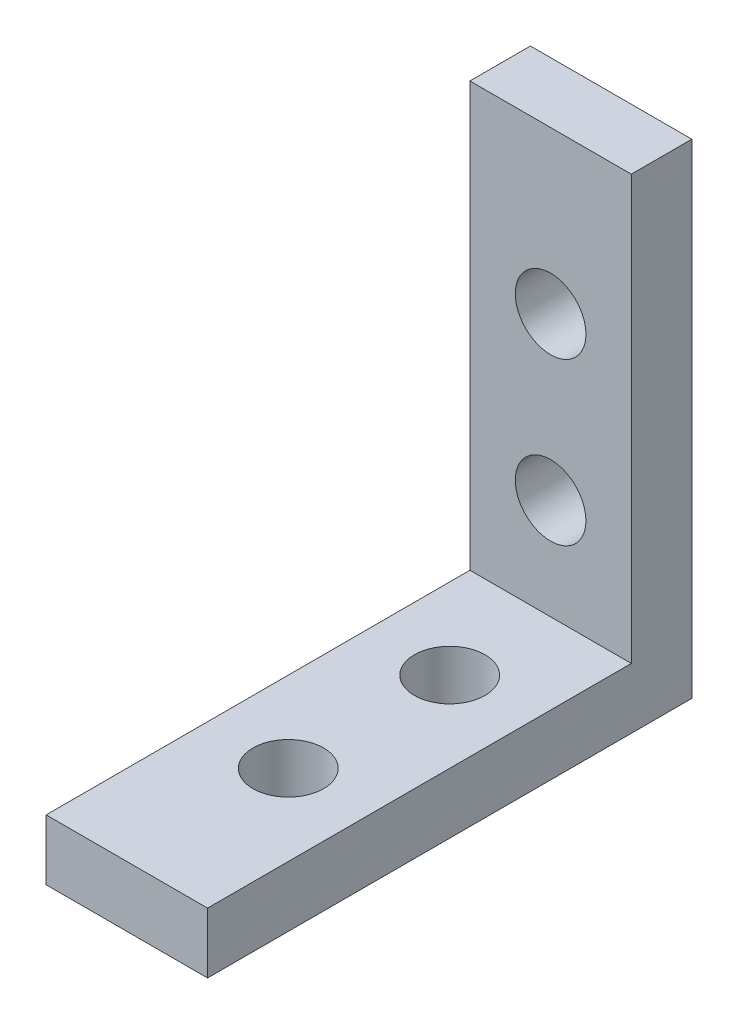
ISO-10303-21;
HEADER;
FILE_DESCRIPTION(('STEP AP214'),'2;1');
FILE_NAME('part.step','',(''),(''),'','','');
FILE_SCHEMA(('AUTOMOTIVE_DESIGN { 1 0 10303 214 1 1 1 1 }'));
ENDSEC;
DATA;
#1=APPLICATION_CONTEXT('core data for automotive mechanical design processes');
#2=APPLICATION_PROTOCOL_DEFINITION('international standard','automotive_design',2000,#1);
#3=PRODUCT_CONTEXT('',#1,'mechanical');
#4=PRODUCT('Part','Part','',(#3));
#5=PRODUCT_RELATED_PRODUCT_CATEGORY('part','',(#4));
#6=PRODUCT_DEFINITION_FORMATION('','',#4);
#7=PRODUCT_DEFINITION_CONTEXT('part definition',#1,'design');
#8=PRODUCT_DEFINITION('design','',#6,#7);
#9=PRODUCT_DEFINITION_SHAPE('','',#8);
#10=(LENGTH_UNIT() NAMED_UNIT(*) SI_UNIT(.MILLI.,.METRE.));
#11=(NAMED_UNIT(*) PLANE_ANGLE_UNIT() SI_UNIT($,.RADIAN.));
#12=(NAMED_UNIT(*) SI_UNIT($,.STERADIAN.) SOLID_ANGLE_UNIT());
#13=UNCERTAINTY_MEASURE_WITH_UNIT(LENGTH_MEASURE(1.E-05),#10,'distance_accuracy_value','');
#14=(GEOMETRIC_REPRESENTATION_CONTEXT(3) GLOBAL_UNCERTAINTY_ASSIGNED_CONTEXT((#13)) GLOBAL_UNIT_ASSIGNED_CONTEXT((#10,
#11,#12)) REPRESENTATION_CONTEXT('',''));
#15=CARTESIAN_POINT('',(0.,0.,0.));
#16=DIRECTION('',(0.,0.,1.));
#17=DIRECTION('',(1.,0.,0.));
#18=AXIS2_PLACEMENT_3D('',#15,#16,#17);
#19=CARTESIAN_POINT('',(-57.5649660985685,28.2941716368271,3.));
#20=DIRECTION('',(1.,0.,0.));
#21=DIRECTION('',(0.,0.,-1.));
#22=AXIS2_PLACEMENT_3D('',#19,#20,#21);
#23=PLANE('',#22);
#24=DIRECTION('',(0.,-1.,0.));
#25=VECTOR('',#24,1.);
#26=CARTESIAN_POINT('',(-57.5649660985685,28.2941716368271,0.));
#27=LINE('',#26,#25);
#28=CARTESIAN_POINT('',(-57.5649660985685,28.2941716368271,0.));
#29=VERTEX_POINT('',#28);
#30=CARTESIAN_POINT('',(-57.5649660985685,4.29417163682707,0.));
#31=VERTEX_POINT('',#30);
#32=EDGE_CURVE('E89',#29,#31,#27,.T.);
#33=ORIENTED_EDGE('',*,*,#32,.T.);
#34=DIRECTION('',(0.,0.,-1.));
#35=VECTOR('',#34,1.);
#36=CARTESIAN_POINT('',(-57.5649660985685,4.29417163682707,3.));
#37=LINE('',#36,#35);
#38=CARTESIAN_POINT('',(-57.5649660985685,4.29417163682707,24.));
#39=VERTEX_POINT('',#38);
#40=EDGE_CURVE('E11',#39,#31,#37,.T.);
#41=ORIENTED_EDGE('',*,*,#40,.F.);
#42=DIRECTION('',(0.,-1.,0.));
#43=VECTOR('',#42,1.);
#44=CARTESIAN_POINT('',(-57.5649660985685,4.29417163682707,24.));
#45=LINE('',#44,#43);
#46=CARTESIAN_POINT('',(-57.5649660985685,7.29417163682707,24.));
#47=VERTEX_POINT('',#46);
#48=EDGE_CURVE('E131',#47,#39,#45,.T.);
#49=ORIENTED_EDGE('',*,*,#48,.F.);
#50=DIRECTION('',(0.,0.,-1.));
#51=VECTOR('',#50,1.);
#52=CARTESIAN_POINT('',(-57.5649660985685,7.29417163682707,24.));
#53=LINE('',#52,#51);
#54=CARTESIAN_POINT('',(-57.5649660985685,7.29417163682707,3.));
#55=VERTEX_POINT('',#54);
#56=EDGE_CURVE('E98',#47,#55,#53,.T.);
#57=ORIENTED_EDGE('',*,*,#56,.T.);
#58=DIRECTION('',(0.,-1.,0.));
#59=VECTOR('',#58,1.);
#60=CARTESIAN_POINT('',(-57.5649660985685,28.2941716368271,3.));
#61=LINE('',#60,#59);
#62=CARTESIAN_POINT('',(-57.5649660985685,28.2941716368271,3.));
#63=VERTEX_POINT('',#62);
#64=EDGE_CURVE('E83',#63,#55,#61,.T.);
#65=ORIENTED_EDGE('',*,*,#64,.F.);
#66=DIRECTION('',(0.,0.,-1.));
#67=VECTOR('',#66,1.);
#68=CARTESIAN_POINT('',(-57.5649660985685,28.2941716368271,3.));
#69=LINE('',#68,#67);
#70=EDGE_CURVE('E76',#63,#29,#69,.T.);
#71=ORIENTED_EDGE('',*,*,#70,.T.);
#72=EDGE_LOOP('',(#33,#41,#49,#57,#65,#71));
#73=FACE_BOUND('',#72,.T.);
#74=ADVANCED_FACE('F32',(#73),#23,.F.);
#75=CARTESIAN_POINT('',(-57.5649660985685,4.29417163682707,3.));
#76=DIRECTION('',(0.,1.,0.));
#77=DIRECTION('',(0.,0.,1.));
#78=AXIS2_PLACEMENT_3D('',#75,#76,#77);
#79=PLANE('',#78);
#80=CARTESIAN_POINT('',(-53.5649660985685,4.29417163682707,16.));
#81=DIRECTION('',(0.,-1.,0.));
#82=DIRECTION('',(0.,0.,-1.));
#83=AXIS2_PLACEMENT_3D('',#80,#81,#82);
#84=CIRCLE('',#83,1.75);
#85=CARTESIAN_POINT('',(-53.5649660985685,4.29417163682707,14.25));
#86=VERTEX_POINT('',#85);
#87=EDGE_CURVE('E120',#86,#86,#84,.T.);
#88=ORIENTED_EDGE('',*,*,#87,.F.);
#89=EDGE_LOOP('',(#88));
#90=FACE_BOUND('',#89,.T.);
#91=CARTESIAN_POINT('',(-53.5649660985685,4.29417163682707,8.));
#92=DIRECTION('',(0.,-1.,0.));
#93=DIRECTION('',(0.,0.,-1.));
#94=AXIS2_PLACEMENT_3D('',#91,#92,#93);
#95=CIRCLE('',#94,1.75);
#96=CARTESIAN_POINT('',(-53.5649660985685,4.29417163682707,6.25));
#97=VERTEX_POINT('',#96);
#98=EDGE_CURVE('E109',#97,#97,#95,.T.);
#99=ORIENTED_EDGE('',*,*,#98,.F.);
#100=EDGE_LOOP('',(#99));
#101=FACE_BOUND('',#100,.T.);
#102=DIRECTION('',(1.,0.,0.));
#103=VECTOR('',#102,1.);
#104=CARTESIAN_POINT('',(-57.5649660985685,4.29417163682707,0.));
#105=LINE('',#104,#103);
#106=CARTESIAN_POINT('',(-49.5649660985685,4.29417163682707,0.));
#107=VERTEX_POINT('',#106);
#108=EDGE_CURVE('E93',#31,#107,#105,.T.);
#109=ORIENTED_EDGE('',*,*,#108,.T.);
#110=DIRECTION('',(0.,0.,-1.));
#111=VECTOR('',#110,1.);
#112=CARTESIAN_POINT('',(-49.5649660985685,4.29417163682707,3.));
#113=LINE('',#112,#111);
#114=CARTESIAN_POINT('',(-49.5649660985685,4.29417163682707,24.));
#115=VERTEX_POINT('',#114);
#116=EDGE_CURVE('E40',#115,#107,#113,.T.);
#117=ORIENTED_EDGE('',*,*,#116,.F.);
#118=DIRECTION('',(1.,0.,0.));
#119=VECTOR('',#118,1.);
#120=CARTESIAN_POINT('',(-57.5649660985685,4.29417163682707,24.));
#121=LINE('',#120,#119);
#122=EDGE_CURVE('E134',#39,#115,#121,.T.);
#123=ORIENTED_EDGE('',*,*,#122,.F.);
#124=ORIENTED_EDGE('',*,*,#40,.T.);
#125=EDGE_LOOP('',(#109,#117,#123,#124));
#126=FACE_BOUND('',#125,.T.);
#127=ADVANCED_FACE('F155',(#90,#101,#126),#79,.F.);
#128=CARTESIAN_POINT('',(-49.5649660985685,28.2941716368271,3.));
#129=DIRECTION('',(-1.,0.,0.));
#130=DIRECTION('',(0.,-1.,0.));
#131=AXIS2_PLACEMENT_3D('',#128,#129,#130);
#132=PLANE('',#131);
#133=DIRECTION('',(0.,1.,0.));
#134=VECTOR('',#133,1.);
#135=CARTESIAN_POINT('',(-49.5649660985685,28.2941716368271,0.));
#136=LINE('',#135,#134);
#137=CARTESIAN_POINT('',(-49.5649660985685,28.2941716368271,0.));
#138=VERTEX_POINT('',#137);
#139=EDGE_CURVE('E84',#107,#138,#136,.T.);
#140=ORIENTED_EDGE('',*,*,#139,.T.);
#141=DIRECTION('',(0.,0.,-1.));
#142=VECTOR('',#141,1.);
#143=CARTESIAN_POINT('',(-49.5649660985685,28.2941716368271,3.));
#144=LINE('',#143,#142);
#145=CARTESIAN_POINT('',(-49.5649660985685,28.2941716368271,3.));
#146=VERTEX_POINT('',#145);
#147=EDGE_CURVE('E79',#146,#138,#144,.T.);
#148=ORIENTED_EDGE('',*,*,#147,.F.);
#149=DIRECTION('',(0.,1.,0.));
#150=VECTOR('',#149,1.);
#151=CARTESIAN_POINT('',(-49.5649660985685,28.2941716368271,3.));
#152=LINE('',#151,#150);
#153=CARTESIAN_POINT('',(-49.5649660985685,7.29417163682707,3.));
#154=VERTEX_POINT('',#153);
#155=EDGE_CURVE('E145',#154,#146,#152,.T.);
#156=ORIENTED_EDGE('',*,*,#155,.F.);
#157=DIRECTION('',(0.,0.,-1.));
#158=VECTOR('',#157,1.);
#159=CARTESIAN_POINT('',(-49.5649660985685,7.29417163682707,24.));
#160=LINE('',#159,#158);
#161=CARTESIAN_POINT('',(-49.5649660985685,7.29417163682707,24.));
#162=VERTEX_POINT('',#161);
#163=EDGE_CURVE('E94',#162,#154,#160,.T.);
#164=ORIENTED_EDGE('',*,*,#163,.F.);
#165=DIRECTION('',(0.,1.,0.));
#166=VECTOR('',#165,1.);
#167=CARTESIAN_POINT('',(-49.5649660985685,4.29417163682707,24.));
#168=LINE('',#167,#166);
#169=EDGE_CURVE('E137',#115,#162,#168,.T.);
#170=ORIENTED_EDGE('',*,*,#169,.F.);
#171=ORIENTED_EDGE('',*,*,#116,.T.);
#172=EDGE_LOOP('',(#140,#148,#156,#164,#170,#171));
#173=FACE_BOUND('',#172,.T.);
#174=ADVANCED_FACE('F149',(#173),#132,.F.);
#175=CARTESIAN_POINT('',(-57.5649660985685,28.2941716368271,3.));
#176=DIRECTION('',(0.,-1.,0.));
#177=DIRECTION('',(0.,0.,-1.));
#178=AXIS2_PLACEMENT_3D('',#175,#176,#177);
#179=PLANE('',#178);
#180=DIRECTION('',(-1.,0.,0.));
#181=VECTOR('',#180,1.);
#182=CARTESIAN_POINT('',(-57.5649660985685,28.2941716368271,0.));
#183=LINE('',#182,#181);
#184=EDGE_CURVE('E73',#138,#29,#183,.T.);
#185=ORIENTED_EDGE('',*,*,#184,.T.);
#186=ORIENTED_EDGE('',*,*,#70,.F.);
#187=DIRECTION('',(-1.,0.,0.));
#188=VECTOR('',#187,1.);
#189=CARTESIAN_POINT('',(-57.5649660985685,28.2941716368271,3.));
#190=LINE('',#189,#188);
#191=EDGE_CURVE('E54',#146,#63,#190,.T.);
#192=ORIENTED_EDGE('',*,*,#191,.F.);
#193=ORIENTED_EDGE('',*,*,#147,.T.);
#194=EDGE_LOOP('',(#185,#186,#192,#193));
#195=FACE_BOUND('',#194,.T.);
#196=ADVANCED_FACE('F75',(#195),#179,.F.);
#197=CARTESIAN_POINT('',(0.,0.,3.));
#198=DIRECTION('',(0.,0.,1.));
#199=DIRECTION('',(1.,0.,0.));
#200=AXIS2_PLACEMENT_3D('',#197,#198,#199);
#201=PLANE('',#200);
#202=CARTESIAN_POINT('',(-53.5649660985685,20.2941716368271,3.));
#203=DIRECTION('',(0.,0.,1.));
#204=DIRECTION('',(1.,0.,0.));
#205=AXIS2_PLACEMENT_3D('',#202,#203,#204);
#206=CIRCLE('',#205,1.75);
#207=CARTESIAN_POINT('',(-51.8149660985685,20.2941716368271,3.));
#208=VERTEX_POINT('',#207);
#209=EDGE_CURVE('E113',#208,#208,#206,.T.);
#210=ORIENTED_EDGE('',*,*,#209,.F.);
#211=EDGE_LOOP('',(#210));
#212=FACE_BOUND('',#211,.T.);
#213=CARTESIAN_POINT('',(-53.5649660985685,12.2941716368271,3.));
#214=DIRECTION('',(0.,0.,1.));
#215=DIRECTION('',(1.,0.,0.));
#216=AXIS2_PLACEMENT_3D('',#213,#214,#215);
#217=CIRCLE('',#216,1.75);
#218=CARTESIAN_POINT('',(-51.8149660985685,12.2941716368271,3.));
#219=VERTEX_POINT('',#218);
#220=EDGE_CURVE('E128',#219,#219,#217,.T.);
#221=ORIENTED_EDGE('',*,*,#220,.F.);
#222=EDGE_LOOP('',(#221));
#223=FACE_BOUND('',#222,.T.);
#224=DIRECTION('',(-1.,0.,0.));
#225=VECTOR('',#224,1.);
#226=CARTESIAN_POINT('',(-57.5649660985685,7.29417163682707,3.));
#227=LINE('',#226,#225);
#228=EDGE_CURVE('E48',#154,#55,#227,.T.);
#229=ORIENTED_EDGE('',*,*,#228,.F.);
#230=ORIENTED_EDGE('',*,*,#155,.T.);
#231=ORIENTED_EDGE('',*,*,#191,.T.);
#232=ORIENTED_EDGE('',*,*,#64,.T.);
#233=EDGE_LOOP('',(#229,#230,#231,#232));
#234=FACE_BOUND('',#233,.T.);
#235=ADVANCED_FACE('F146',(#212,#223,#234),#201,.T.);
#236=CARTESIAN_POINT('',(0.,0.,0.));
#237=DIRECTION('',(0.,0.,1.));
#238=DIRECTION('',(1.,0.,0.));
#239=AXIS2_PLACEMENT_3D('',#236,#237,#238);
#240=PLANE('',#239);
#241=CARTESIAN_POINT('',(-53.5649660985685,20.2941716368271,0.));
#242=DIRECTION('',(0.,0.,-1.));
#243=DIRECTION('',(-1.,0.,0.));
#244=AXIS2_PLACEMENT_3D('',#241,#242,#243);
#245=CIRCLE('',#244,1.75);
#246=CARTESIAN_POINT('',(-55.3149660985685,20.2941716368271,0.));
#247=VERTEX_POINT('',#246);
#248=EDGE_CURVE('E108',#247,#247,#245,.T.);
#249=ORIENTED_EDGE('',*,*,#248,.F.);
#250=EDGE_LOOP('',(#249));
#251=FACE_BOUND('',#250,.T.);
#252=CARTESIAN_POINT('',(-53.5649660985685,12.2941716368271,0.));
#253=DIRECTION('',(0.,0.,-1.));
#254=DIRECTION('',(-1.,0.,0.));
#255=AXIS2_PLACEMENT_3D('',#252,#253,#254);
#256=CIRCLE('',#255,1.75);
#257=CARTESIAN_POINT('',(-55.3149660985685,12.2941716368271,0.));
#258=VERTEX_POINT('',#257);
#259=EDGE_CURVE('E125',#258,#258,#256,.T.);
#260=ORIENTED_EDGE('',*,*,#259,.F.);
#261=EDGE_LOOP('',(#260));
#262=FACE_BOUND('',#261,.T.);
#263=ORIENTED_EDGE('',*,*,#32,.F.);
#264=ORIENTED_EDGE('',*,*,#184,.F.);
#265=ORIENTED_EDGE('',*,*,#139,.F.);
#266=ORIENTED_EDGE('',*,*,#108,.F.);
#267=EDGE_LOOP('',(#263,#264,#265,#266));
#268=FACE_BOUND('',#267,.T.);
#269=ADVANCED_FACE('F92',(#251,#262,#268),#240,.F.);
#270=CARTESIAN_POINT('',(-57.5649660985685,7.29417163682707,24.));
#271=DIRECTION('',(0.,-1.,0.));
#272=DIRECTION('',(0.,0.,-1.));
#273=AXIS2_PLACEMENT_3D('',#270,#271,#272);
#274=PLANE('',#273);
#275=CARTESIAN_POINT('',(-53.5649660985685,7.29417163682707,16.));
#276=DIRECTION('',(0.,-1.,0.));
#277=DIRECTION('',(0.,0.,-1.));
#278=AXIS2_PLACEMENT_3D('',#275,#276,#277);
#279=CIRCLE('',#278,1.75);
#280=CARTESIAN_POINT('',(-53.5649660985685,7.29417163682707,14.25));
#281=VERTEX_POINT('',#280);
#282=EDGE_CURVE('E35',#281,#281,#279,.T.);
#283=ORIENTED_EDGE('',*,*,#282,.T.);
#284=EDGE_LOOP('',(#283));
#285=FACE_BOUND('',#284,.T.);
#286=CARTESIAN_POINT('',(-53.5649660985685,7.29417163682707,8.));
#287=DIRECTION('',(0.,-1.,0.));
#288=DIRECTION('',(0.,0.,-1.));
#289=AXIS2_PLACEMENT_3D('',#286,#287,#288);
#290=CIRCLE('',#289,1.75);
#291=CARTESIAN_POINT('',(-53.5649660985685,7.29417163682707,6.25));
#292=VERTEX_POINT('',#291);
#293=EDGE_CURVE('E106',#292,#292,#290,.T.);
#294=ORIENTED_EDGE('',*,*,#293,.T.);
#295=EDGE_LOOP('',(#294));
#296=FACE_BOUND('',#295,.T.);
#297=ORIENTED_EDGE('',*,*,#228,.T.);
#298=ORIENTED_EDGE('',*,*,#56,.F.);
#299=DIRECTION('',(-1.,0.,0.));
#300=VECTOR('',#299,1.);
#301=CARTESIAN_POINT('',(-57.5649660985685,7.29417163682707,24.));
#302=LINE('',#301,#300);
#303=EDGE_CURVE('E140',#162,#47,#302,.T.);
#304=ORIENTED_EDGE('',*,*,#303,.F.);
#305=ORIENTED_EDGE('',*,*,#163,.T.);
#306=EDGE_LOOP('',(#297,#298,#304,#305));
#307=FACE_BOUND('',#306,.T.);
#308=ADVANCED_FACE('F169',(#285,#296,#307),#274,.F.);
#309=CARTESIAN_POINT('',(0.,0.,24.));
#310=DIRECTION('',(0.,0.,-1.));
#311=DIRECTION('',(-1.,0.,0.));
#312=AXIS2_PLACEMENT_3D('',#309,#310,#311);
#313=PLANE('',#312);
#314=ORIENTED_EDGE('',*,*,#48,.T.);
#315=ORIENTED_EDGE('',*,*,#122,.T.);
#316=ORIENTED_EDGE('',*,*,#169,.T.);
#317=ORIENTED_EDGE('',*,*,#303,.T.);
#318=EDGE_LOOP('',(#314,#315,#316,#317));
#319=FACE_BOUND('',#318,.T.);
#320=ADVANCED_FACE('F160',(#319),#313,.F.);
#321=CARTESIAN_POINT('',(-53.5649660985685,12.2941716368271,10.));
#322=DIRECTION('',(0.,0.,-1.));
#323=DIRECTION('',(-1.,0.,0.));
#324=AXIS2_PLACEMENT_3D('',#321,#322,#323);
#325=CYLINDRICAL_SURFACE('',#324,1.75);
#326=ORIENTED_EDGE('',*,*,#220,.T.);
#327=EDGE_LOOP('',(#326));
#328=FACE_BOUND('',#327,.T.);
#329=ORIENTED_EDGE('',*,*,#259,.T.);
#330=EDGE_LOOP('',(#329));
#331=FACE_BOUND('',#330,.T.);
#332=ADVANCED_FACE('F177',(#328,#331),#325,.F.);
#333=CARTESIAN_POINT('',(-53.5649660985685,20.2941716368271,10.));
#334=DIRECTION('',(0.,0.,-1.));
#335=DIRECTION('',(-1.,0.,0.));
#336=AXIS2_PLACEMENT_3D('',#333,#334,#335);
#337=CYLINDRICAL_SURFACE('',#336,1.75);
#338=ORIENTED_EDGE('',*,*,#209,.T.);
#339=EDGE_LOOP('',(#338));
#340=FACE_BOUND('',#339,.T.);
#341=ORIENTED_EDGE('',*,*,#248,.T.);
#342=EDGE_LOOP('',(#341));
#343=FACE_BOUND('',#342,.T.);
#344=ADVANCED_FACE('F205',(#340,#343),#337,.F.);
#345=CARTESIAN_POINT('',(-53.5649660985685,14.2941716368271,8.));
#346=DIRECTION('',(0.,-1.,0.));
#347=DIRECTION('',(0.,0.,-1.));
#348=AXIS2_PLACEMENT_3D('',#345,#346,#347);
#349=CYLINDRICAL_SURFACE('',#348,1.75);
#350=ORIENTED_EDGE('',*,*,#98,.T.);
#351=EDGE_LOOP('',(#350));
#352=FACE_BOUND('',#351,.T.);
#353=ORIENTED_EDGE('',*,*,#293,.F.);
#354=EDGE_LOOP('',(#353));
#355=FACE_BOUND('',#354,.T.);
#356=ADVANCED_FACE('F212',(#352,#355),#349,.F.);
#357=CARTESIAN_POINT('',(-53.5649660985685,14.2941716368271,16.));
#358=DIRECTION('',(0.,-1.,0.));
#359=DIRECTION('',(0.,0.,-1.));
#360=AXIS2_PLACEMENT_3D('',#357,#358,#359);
#361=CYLINDRICAL_SURFACE('',#360,1.75);
#362=ORIENTED_EDGE('',*,*,#87,.T.);
#363=EDGE_LOOP('',(#362));
#364=FACE_BOUND('',#363,.T.);
#365=ORIENTED_EDGE('',*,*,#282,.F.);
#366=EDGE_LOOP('',(#365));
#367=FACE_BOUND('',#366,.T.);
#368=ADVANCED_FACE('F218',(#364,#367),#361,.F.);
#369=CLOSED_SHELL('',(#74,#127,#174,#196,#235,#269,#308,#320,#332,#344,#356,#368));
#370=MANIFOLD_SOLID_BREP('B2',#369);
#371=ADVANCED_BREP_SHAPE_REPRESENTATION('',(#18,#370),#14);
#372=SHAPE_DEFINITION_REPRESENTATION(#9,#371);
ENDSEC;
END-ISO-10303-21;
